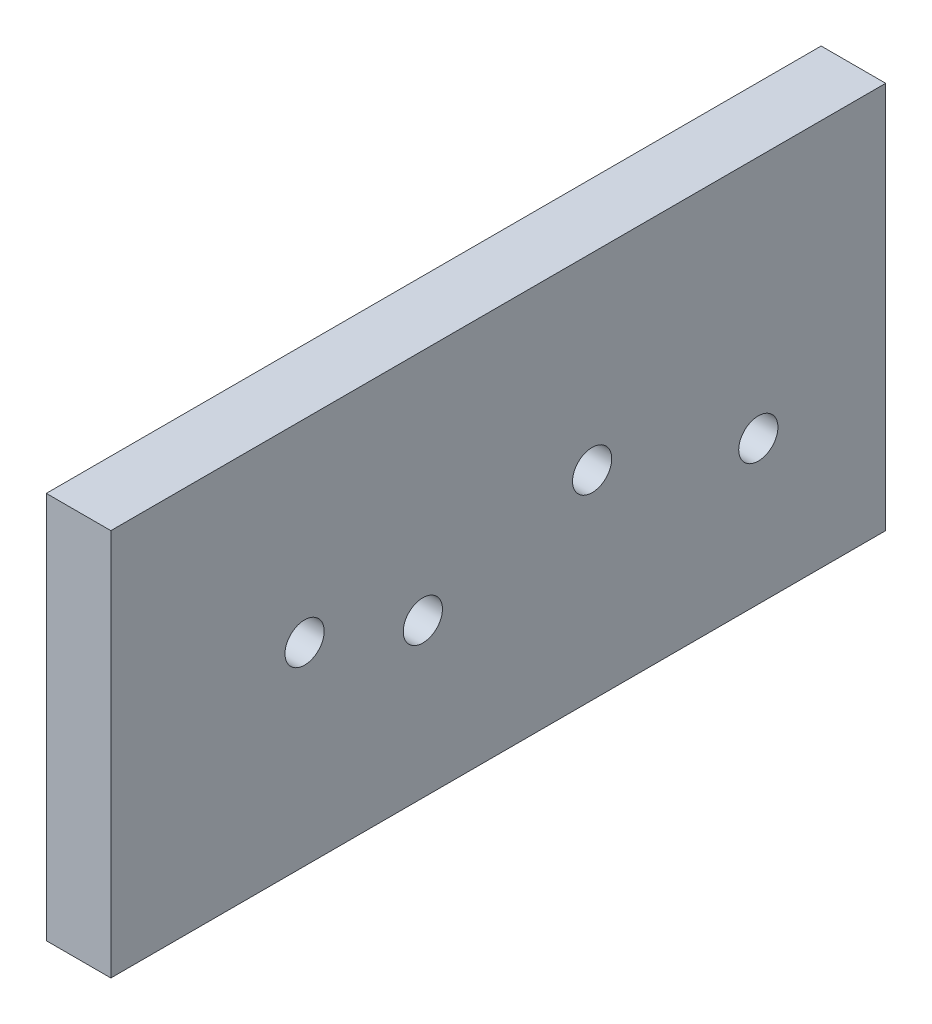
ISO-10303-21;
HEADER;
FILE_DESCRIPTION(('STEP AP214'),'2;1');
FILE_NAME('part.step','',(''),(''),'','','');
FILE_SCHEMA(('AUTOMOTIVE_DESIGN { 1 0 10303 214 1 1 1 1 }'));
ENDSEC;
DATA;
#1=APPLICATION_CONTEXT('core data for automotive mechanical design processes');
#2=APPLICATION_PROTOCOL_DEFINITION('international standard','automotive_design',2000,#1);
#3=PRODUCT_CONTEXT('',#1,'mechanical');
#4=PRODUCT('Part','Part','',(#3));
#5=PRODUCT_RELATED_PRODUCT_CATEGORY('part','',(#4));
#6=PRODUCT_DEFINITION_FORMATION('','',#4);
#7=PRODUCT_DEFINITION_CONTEXT('part definition',#1,'design');
#8=PRODUCT_DEFINITION('design','',#6,#7);
#9=PRODUCT_DEFINITION_SHAPE('','',#8);
#10=(LENGTH_UNIT() NAMED_UNIT(*) SI_UNIT(.MILLI.,.METRE.));
#11=(NAMED_UNIT(*) PLANE_ANGLE_UNIT() SI_UNIT($,.RADIAN.));
#12=(NAMED_UNIT(*) SI_UNIT($,.STERADIAN.) SOLID_ANGLE_UNIT());
#13=UNCERTAINTY_MEASURE_WITH_UNIT(LENGTH_MEASURE(1.E-05),#10,'distance_accuracy_value','');
#14=(GEOMETRIC_REPRESENTATION_CONTEXT(3) GLOBAL_UNCERTAINTY_ASSIGNED_CONTEXT((#13)) GLOBAL_UNIT_ASSIGNED_CONTEXT((#10,
#11,#12)) REPRESENTATION_CONTEXT('',''));
#15=CARTESIAN_POINT('',(0.,0.,0.));
#16=DIRECTION('',(0.,0.,1.));
#17=DIRECTION('',(1.,0.,0.));
#18=AXIS2_PLACEMENT_3D('',#15,#16,#17);
#19=CARTESIAN_POINT('',(12.7,-9.873506971,-51.1434579937716));
#20=DIRECTION('',(-1.,0.,0.));
#21=DIRECTION('',(0.,0.,1.));
#22=AXIS2_PLACEMENT_3D('',#19,#20,#21);
#23=CYLINDRICAL_SURFACE('',#22,3.85455777521835);
#24=CARTESIAN_POINT('',(12.7,-9.873506971,-51.1434579937716));
#25=DIRECTION('',(1.,0.,0.));
#26=DIRECTION('',(0.,0.,-1.));
#27=AXIS2_PLACEMENT_3D('',#24,#25,#26);
#28=CIRCLE('',#27,3.85455777521835);
#29=CARTESIAN_POINT('',(12.7,-9.873506971,-54.99801576899));
#30=VERTEX_POINT('',#29);
#31=EDGE_CURVE('E162',#30,#30,#28,.T.);
#32=ORIENTED_EDGE('',*,*,#31,.T.);
#33=EDGE_LOOP('',(#32));
#34=FACE_BOUND('',#33,.T.);
#35=CARTESIAN_POINT('',(6.35,-9.873506971,-51.1434579937716));
#36=DIRECTION('',(-1.,0.,0.));
#37=DIRECTION('',(0.,0.,1.));
#38=AXIS2_PLACEMENT_3D('',#35,#36,#37);
#39=CIRCLE('',#38,3.85455777521835);
#40=CARTESIAN_POINT('',(6.35,-9.873506971,-47.2889002185533));
#41=VERTEX_POINT('',#40);
#42=EDGE_CURVE('E53',#41,#41,#39,.T.);
#43=ORIENTED_EDGE('',*,*,#42,.T.);
#44=EDGE_LOOP('',(#43));
#45=FACE_BOUND('',#44,.T.);
#46=ADVANCED_FACE('F49',(#34,#45),#23,.F.);
#47=CARTESIAN_POINT('',(12.7,1.096077429,-18.4577335821185));
#48=DIRECTION('',(-1.,0.,0.));
#49=DIRECTION('',(0.,0.,1.));
#50=AXIS2_PLACEMENT_3D('',#47,#48,#49);
#51=CYLINDRICAL_SURFACE('',#50,3.85455777521835);
#52=CARTESIAN_POINT('',(12.7,1.096077429,-18.4577335821185));
#53=DIRECTION('',(1.,0.,0.));
#54=DIRECTION('',(0.,0.,-1.));
#55=AXIS2_PLACEMENT_3D('',#52,#53,#54);
#56=CIRCLE('',#55,3.85455777521835);
#57=CARTESIAN_POINT('',(12.7,1.096077429,-22.3122913573368));
#58=VERTEX_POINT('',#57);
#59=EDGE_CURVE('E158',#58,#58,#56,.T.);
#60=ORIENTED_EDGE('',*,*,#59,.T.);
#61=EDGE_LOOP('',(#60));
#62=FACE_BOUND('',#61,.T.);
#63=CARTESIAN_POINT('',(6.35,1.096077429,-18.4577335821185));
#64=DIRECTION('',(-1.,0.,0.));
#65=DIRECTION('',(0.,0.,1.));
#66=AXIS2_PLACEMENT_3D('',#63,#64,#65);
#67=CIRCLE('',#66,3.85455777521835);
#68=CARTESIAN_POINT('',(6.35,1.096077429,-14.6031758069001));
#69=VERTEX_POINT('',#68);
#70=EDGE_CURVE('E197',#69,#69,#67,.T.);
#71=ORIENTED_EDGE('',*,*,#70,.T.);
#72=EDGE_LOOP('',(#71));
#73=FACE_BOUND('',#72,.T.);
#74=ADVANCED_FACE('F285',(#62,#73),#51,.F.);
#75=CARTESIAN_POINT('',(12.7,0.,38.1));
#76=DIRECTION('',(-1.,0.,0.));
#77=DIRECTION('',(0.,0.,1.));
#78=AXIS2_PLACEMENT_3D('',#75,#76,#77);
#79=CYLINDRICAL_SURFACE('',#78,3.85455777521835);
#80=CARTESIAN_POINT('',(12.7,0.,38.1));
#81=DIRECTION('',(1.,0.,0.));
#82=DIRECTION('',(0.,0.,-1.));
#83=AXIS2_PLACEMENT_3D('',#80,#81,#82);
#84=CIRCLE('',#83,3.85455777521835);
#85=CARTESIAN_POINT('',(12.7,0.,34.2454422247817));
#86=VERTEX_POINT('',#85);
#87=EDGE_CURVE('E154',#86,#86,#84,.T.);
#88=ORIENTED_EDGE('',*,*,#87,.T.);
#89=EDGE_LOOP('',(#88));
#90=FACE_BOUND('',#89,.T.);
#91=CARTESIAN_POINT('',(6.35,0.,38.1));
#92=DIRECTION('',(-1.,0.,0.));
#93=DIRECTION('',(0.,0.,1.));
#94=AXIS2_PLACEMENT_3D('',#91,#92,#93);
#95=CIRCLE('',#94,3.85455777521835);
#96=CARTESIAN_POINT('',(6.35,0.,41.9545577752184));
#97=VERTEX_POINT('',#96);
#98=EDGE_CURVE('E193',#97,#97,#95,.T.);
#99=ORIENTED_EDGE('',*,*,#98,.T.);
#100=EDGE_LOOP('',(#99));
#101=FACE_BOUND('',#100,.T.);
#102=ADVANCED_FACE('F292',(#90,#101),#79,.F.);
#103=CARTESIAN_POINT('',(12.7,-7.860160654,14.8360220129459));
#104=DIRECTION('',(-1.,0.,0.));
#105=DIRECTION('',(0.,0.,1.));
#106=AXIS2_PLACEMENT_3D('',#103,#104,#105);
#107=CYLINDRICAL_SURFACE('',#106,3.85455777521835);
#108=CARTESIAN_POINT('',(12.7,-7.860160654,14.8360220129459));
#109=DIRECTION('',(1.,0.,0.));
#110=DIRECTION('',(0.,0.,-1.));
#111=AXIS2_PLACEMENT_3D('',#108,#109,#110);
#112=CIRCLE('',#111,3.85455777521835);
#113=CARTESIAN_POINT('',(12.7,-7.860160654,10.9814642377276));
#114=VERTEX_POINT('',#113);
#115=EDGE_CURVE('E166',#114,#114,#112,.T.);
#116=ORIENTED_EDGE('',*,*,#115,.T.);
#117=EDGE_LOOP('',(#116));
#118=FACE_BOUND('',#117,.T.);
#119=CARTESIAN_POINT('',(6.35,-7.860160654,14.8360220129459));
#120=DIRECTION('',(-1.,0.,0.));
#121=DIRECTION('',(0.,0.,1.));
#122=AXIS2_PLACEMENT_3D('',#119,#120,#121);
#123=CIRCLE('',#122,3.85455777521835);
#124=CARTESIAN_POINT('',(6.35,-7.860160654,18.6905797881643));
#125=VERTEX_POINT('',#124);
#126=EDGE_CURVE('E189',#125,#125,#123,.T.);
#127=ORIENTED_EDGE('',*,*,#126,.T.);
#128=EDGE_LOOP('',(#127));
#129=FACE_BOUND('',#128,.T.);
#130=ADVANCED_FACE('F296',(#118,#129),#107,.F.);
#131=CARTESIAN_POINT('',(12.7,-38.1,0.));
#132=DIRECTION('',(0.,1.,0.));
#133=DIRECTION('',(0.,0.,1.));
#134=AXIS2_PLACEMENT_3D('',#131,#132,#133);
#135=PLANE('',#134);
#136=CARTESIAN_POINT('',(6.35000000000002,-38.1,-63.5));
#137=DIRECTION('',(0.,-1.,0.));
#138=DIRECTION('',(0.,0.,-1.));
#139=AXIS2_PLACEMENT_3D('',#136,#137,#138);
#140=CIRCLE('',#139,3.17499999999999);
#141=CARTESIAN_POINT('',(6.35000000000002,-38.1,-66.675));
#142=VERTEX_POINT('',#141);
#143=EDGE_CURVE('E118',#142,#142,#140,.T.);
#144=ORIENTED_EDGE('',*,*,#143,.F.);
#145=EDGE_LOOP('',(#144));
#146=FACE_BOUND('',#145,.T.);
#147=CARTESIAN_POINT('',(6.35000000000001,-38.1,0.));
#148=DIRECTION('',(0.,-1.,0.));
#149=DIRECTION('',(0.,0.,-1.));
#150=AXIS2_PLACEMENT_3D('',#147,#148,#149);
#151=CIRCLE('',#150,3.17499999999999);
#152=CARTESIAN_POINT('',(6.35000000000001,-38.1,-3.17499999999997));
#153=VERTEX_POINT('',#152);
#154=EDGE_CURVE('E117',#153,#153,#151,.T.);
#155=ORIENTED_EDGE('',*,*,#154,.F.);
#156=EDGE_LOOP('',(#155));
#157=FACE_BOUND('',#156,.T.);
#158=CARTESIAN_POINT('',(6.35,-38.1,57.15));
#159=DIRECTION('',(0.,-1.,0.));
#160=DIRECTION('',(0.,0.,-1.));
#161=AXIS2_PLACEMENT_3D('',#158,#159,#160);
#162=CIRCLE('',#161,3.17499999999999);
#163=CARTESIAN_POINT('',(6.35,-38.1,53.975));
#164=VERTEX_POINT('',#163);
#165=EDGE_CURVE('E132',#164,#164,#162,.T.);
#166=ORIENTED_EDGE('',*,*,#165,.F.);
#167=EDGE_LOOP('',(#166));
#168=FACE_BOUND('',#167,.T.);
#169=DIRECTION('',(0.,0.,-1.));
#170=VECTOR('',#169,1.);
#171=CARTESIAN_POINT('',(0.,-38.1,0.));
#172=LINE('',#171,#170);
#173=CARTESIAN_POINT('',(0.,-38.1,76.2));
#174=VERTEX_POINT('',#173);
#175=CARTESIAN_POINT('',(0.,-38.1,-76.2));
#176=VERTEX_POINT('',#175);
#177=EDGE_CURVE('E140',#174,#176,#172,.T.);
#178=ORIENTED_EDGE('',*,*,#177,.T.);
#179=DIRECTION('',(-1.,0.,0.));
#180=VECTOR('',#179,1.);
#181=CARTESIAN_POINT('',(12.7,-38.1,-76.2));
#182=LINE('',#181,#180);
#183=CARTESIAN_POINT('',(12.7,-38.1,-76.2));
#184=VERTEX_POINT('',#183);
#185=EDGE_CURVE('E11',#184,#176,#182,.T.);
#186=ORIENTED_EDGE('',*,*,#185,.F.);
#187=DIRECTION('',(0.,0.,-1.));
#188=VECTOR('',#187,1.);
#189=CARTESIAN_POINT('',(12.7,-38.1,0.));
#190=LINE('',#189,#188);
#191=CARTESIAN_POINT('',(12.7,-38.1,76.2));
#192=VERTEX_POINT('',#191);
#193=EDGE_CURVE('E141',#192,#184,#190,.T.);
#194=ORIENTED_EDGE('',*,*,#193,.F.);
#195=DIRECTION('',(-1.,0.,0.));
#196=VECTOR('',#195,1.);
#197=CARTESIAN_POINT('',(12.7,-38.1,76.2));
#198=LINE('',#197,#196);
#199=EDGE_CURVE('E69',#192,#174,#198,.T.);
#200=ORIENTED_EDGE('',*,*,#199,.T.);
#201=EDGE_LOOP('',(#178,#186,#194,#200));
#202=FACE_BOUND('',#201,.T.);
#203=ADVANCED_FACE('F51',(#146,#157,#168,#202),#135,.F.);
#204=CARTESIAN_POINT('',(12.7,0.,-76.2));
#205=DIRECTION('',(0.,0.,1.));
#206=DIRECTION('',(1.,0.,0.));
#207=AXIS2_PLACEMENT_3D('',#204,#205,#206);
#208=PLANE('',#207);
#209=DIRECTION('',(0.,1.,0.));
#210=VECTOR('',#209,1.);
#211=CARTESIAN_POINT('',(0.,0.,-76.2));
#212=LINE('',#211,#210);
#213=CARTESIAN_POINT('',(0.,38.1,-76.2));
#214=VERTEX_POINT('',#213);
#215=EDGE_CURVE('E172',#176,#214,#212,.T.);
#216=ORIENTED_EDGE('',*,*,#215,.T.);
#217=DIRECTION('',(-1.,0.,0.));
#218=VECTOR('',#217,1.);
#219=CARTESIAN_POINT('',(12.7,38.1,-76.2));
#220=LINE('',#219,#218);
#221=CARTESIAN_POINT('',(12.7,38.1,-76.2));
#222=VERTEX_POINT('',#221);
#223=EDGE_CURVE('E60',#222,#214,#220,.T.);
#224=ORIENTED_EDGE('',*,*,#223,.F.);
#225=DIRECTION('',(0.,1.,0.));
#226=VECTOR('',#225,1.);
#227=CARTESIAN_POINT('',(12.7,0.,-76.2));
#228=LINE('',#227,#226);
#229=EDGE_CURVE('E95',#184,#222,#228,.T.);
#230=ORIENTED_EDGE('',*,*,#229,.F.);
#231=ORIENTED_EDGE('',*,*,#185,.T.);
#232=EDGE_LOOP('',(#216,#224,#230,#231));
#233=FACE_BOUND('',#232,.T.);
#234=ADVANCED_FACE('F280',(#233),#208,.F.);
#235=CARTESIAN_POINT('',(12.7,38.1,0.));
#236=DIRECTION('',(0.,1.,0.));
#237=DIRECTION('',(0.,0.,1.));
#238=AXIS2_PLACEMENT_3D('',#235,#236,#237);
#239=PLANE('',#238);
#240=DIRECTION('',(0.,0.,-1.));
#241=VECTOR('',#240,1.);
#242=CARTESIAN_POINT('',(0.,38.1,0.));
#243=LINE('',#242,#241);
#244=CARTESIAN_POINT('',(0.,38.1,76.2));
#245=VERTEX_POINT('',#244);
#246=EDGE_CURVE('E176',#245,#214,#243,.T.);
#247=ORIENTED_EDGE('',*,*,#246,.F.);
#248=DIRECTION('',(-1.,0.,0.));
#249=VECTOR('',#248,1.);
#250=CARTESIAN_POINT('',(12.7,38.1,76.2));
#251=LINE('',#250,#249);
#252=CARTESIAN_POINT('',(12.7,38.1,76.2));
#253=VERTEX_POINT('',#252);
#254=EDGE_CURVE('E84',#253,#245,#251,.T.);
#255=ORIENTED_EDGE('',*,*,#254,.F.);
#256=DIRECTION('',(0.,0.,-1.));
#257=VECTOR('',#256,1.);
#258=CARTESIAN_POINT('',(12.7,38.1,0.));
#259=LINE('',#258,#257);
#260=EDGE_CURVE('E147',#253,#222,#259,.T.);
#261=ORIENTED_EDGE('',*,*,#260,.T.);
#262=ORIENTED_EDGE('',*,*,#223,.T.);
#263=EDGE_LOOP('',(#247,#255,#261,#262));
#264=FACE_BOUND('',#263,.T.);
#265=ADVANCED_FACE('F271',(#264),#239,.T.);
#266=CARTESIAN_POINT('',(12.7,0.,76.2));
#267=DIRECTION('',(0.,0.,1.));
#268=DIRECTION('',(1.,0.,0.));
#269=AXIS2_PLACEMENT_3D('',#266,#267,#268);
#270=PLANE('',#269);
#271=DIRECTION('',(0.,1.,0.));
#272=VECTOR('',#271,1.);
#273=CARTESIAN_POINT('',(0.,0.,76.2));
#274=LINE('',#273,#272);
#275=EDGE_CURVE('E144',#174,#245,#274,.T.);
#276=ORIENTED_EDGE('',*,*,#275,.F.);
#277=ORIENTED_EDGE('',*,*,#199,.F.);
#278=DIRECTION('',(0.,1.,0.));
#279=VECTOR('',#278,1.);
#280=CARTESIAN_POINT('',(12.7,0.,76.2));
#281=LINE('',#280,#279);
#282=EDGE_CURVE('E151',#192,#253,#281,.T.);
#283=ORIENTED_EDGE('',*,*,#282,.T.);
#284=ORIENTED_EDGE('',*,*,#254,.T.);
#285=EDGE_LOOP('',(#276,#277,#283,#284));
#286=FACE_BOUND('',#285,.T.);
#287=ADVANCED_FACE('F269',(#286),#270,.T.);
#288=CARTESIAN_POINT('',(12.7,0.,0.));
#289=DIRECTION('',(1.,0.,0.));
#290=DIRECTION('',(0.,0.,-1.));
#291=AXIS2_PLACEMENT_3D('',#288,#289,#290);
#292=PLANE('',#291);
#293=ORIENTED_EDGE('',*,*,#193,.T.);
#294=ORIENTED_EDGE('',*,*,#229,.T.);
#295=ORIENTED_EDGE('',*,*,#260,.F.);
#296=ORIENTED_EDGE('',*,*,#282,.F.);
#297=EDGE_LOOP('',(#293,#294,#295,#296));
#298=FACE_BOUND('',#297,.T.);
#299=ORIENTED_EDGE('',*,*,#87,.F.);
#300=EDGE_LOOP('',(#299));
#301=FACE_BOUND('',#300,.T.);
#302=ORIENTED_EDGE('',*,*,#59,.F.);
#303=EDGE_LOOP('',(#302));
#304=FACE_BOUND('',#303,.T.);
#305=ORIENTED_EDGE('',*,*,#31,.F.);
#306=EDGE_LOOP('',(#305));
#307=FACE_BOUND('',#306,.T.);
#308=ORIENTED_EDGE('',*,*,#115,.F.);
#309=EDGE_LOOP('',(#308));
#310=FACE_BOUND('',#309,.T.);
#311=ADVANCED_FACE('F260',(#298,#301,#304,#307,#310),#292,.T.);
#312=CARTESIAN_POINT('',(0.,0.,0.));
#313=DIRECTION('',(1.,0.,0.));
#314=DIRECTION('',(0.,0.,-1.));
#315=AXIS2_PLACEMENT_3D('',#312,#313,#314);
#316=PLANE('',#315);
#317=CARTESIAN_POINT('',(0.,0.,38.1));
#318=DIRECTION('',(-1.,0.,0.));
#319=DIRECTION('',(0.,0.,1.));
#320=AXIS2_PLACEMENT_3D('',#317,#318,#319);
#321=CIRCLE('',#320,7.9375);
#322=CARTESIAN_POINT('',(0.,0.,46.0375));
#323=VERTEX_POINT('',#322);
#324=EDGE_CURVE('E239',#323,#323,#321,.T.);
#325=ORIENTED_EDGE('',*,*,#324,.F.);
#326=EDGE_LOOP('',(#325));
#327=FACE_BOUND('',#326,.T.);
#328=CARTESIAN_POINT('',(0.,-7.860160654,14.8360220129459));
#329=DIRECTION('',(-1.,0.,0.));
#330=DIRECTION('',(0.,0.,1.));
#331=AXIS2_PLACEMENT_3D('',#328,#329,#330);
#332=CIRCLE('',#331,7.9375);
#333=CARTESIAN_POINT('',(0.,-7.860160654,22.7735220129459));
#334=VERTEX_POINT('',#333);
#335=EDGE_CURVE('E235',#334,#334,#332,.T.);
#336=ORIENTED_EDGE('',*,*,#335,.F.);
#337=EDGE_LOOP('',(#336));
#338=FACE_BOUND('',#337,.T.);
#339=CARTESIAN_POINT('',(0.,1.096077429,-18.4577335821185));
#340=DIRECTION('',(-1.,0.,0.));
#341=DIRECTION('',(0.,0.,1.));
#342=AXIS2_PLACEMENT_3D('',#339,#340,#341);
#343=CIRCLE('',#342,7.9375);
#344=CARTESIAN_POINT('',(0.,1.096077429,-10.5202335821185));
#345=VERTEX_POINT('',#344);
#346=EDGE_CURVE('E227',#345,#345,#343,.T.);
#347=ORIENTED_EDGE('',*,*,#346,.F.);
#348=EDGE_LOOP('',(#347));
#349=FACE_BOUND('',#348,.T.);
#350=CARTESIAN_POINT('',(0.,-9.873506971,-51.1434579937716));
#351=DIRECTION('',(-1.,0.,0.));
#352=DIRECTION('',(0.,0.,1.));
#353=AXIS2_PLACEMENT_3D('',#350,#351,#352);
#354=CIRCLE('',#353,7.9375);
#355=CARTESIAN_POINT('',(0.,-9.873506971,-43.2059579937716));
#356=VERTEX_POINT('',#355);
#357=EDGE_CURVE('E218',#356,#356,#354,.T.);
#358=ORIENTED_EDGE('',*,*,#357,.F.);
#359=EDGE_LOOP('',(#358));
#360=FACE_BOUND('',#359,.T.);
#361=ORIENTED_EDGE('',*,*,#177,.F.);
#362=ORIENTED_EDGE('',*,*,#275,.T.);
#363=ORIENTED_EDGE('',*,*,#246,.T.);
#364=ORIENTED_EDGE('',*,*,#215,.F.);
#365=EDGE_LOOP('',(#361,#362,#363,#364));
#366=FACE_BOUND('',#365,.T.);
#367=ADVANCED_FACE('F256',(#327,#338,#349,#360,#366),#316,.F.);
#368=CARTESIAN_POINT('',(6.35,-25.4,57.15));
#369=DIRECTION('',(0.,-1.,0.));
#370=DIRECTION('',(0.,0.,-1.));
#371=AXIS2_PLACEMENT_3D('',#368,#369,#370);
#372=CONICAL_SURFACE('',#371,3.17499999999999,1.02974425867665);
#373=CARTESIAN_POINT('',(6.35,-23.4922675345875,57.15));
#374=VERTEX_POINT('',#373);
#375=VERTEX_LOOP('',#374);
#376=FACE_BOUND('',#375,.T.);
#377=CARTESIAN_POINT('',(6.35,-25.4,57.15));
#378=DIRECTION('',(0.,-1.,0.));
#379=DIRECTION('',(0.,0.,-1.));
#380=AXIS2_PLACEMENT_3D('',#377,#378,#379);
#381=CIRCLE('',#380,3.17499999999999);
#382=CARTESIAN_POINT('',(6.35,-25.4,53.975));
#383=VERTEX_POINT('',#382);
#384=EDGE_CURVE('E136',#383,#383,#381,.T.);
#385=ORIENTED_EDGE('',*,*,#384,.T.);
#386=EDGE_LOOP('',(#385));
#387=FACE_BOUND('',#386,.T.);
#388=ADVANCED_FACE('F259',(#376,#387),#372,.F.);
#389=CARTESIAN_POINT('',(6.35,-38.1,57.15));
#390=DIRECTION('',(0.,-1.,0.));
#391=DIRECTION('',(0.,0.,-1.));
#392=AXIS2_PLACEMENT_3D('',#389,#390,#391);
#393=CYLINDRICAL_SURFACE('',#392,3.17499999999999);
#394=ORIENTED_EDGE('',*,*,#384,.F.);
#395=EDGE_LOOP('',(#394));
#396=FACE_BOUND('',#395,.T.);
#397=ORIENTED_EDGE('',*,*,#165,.T.);
#398=EDGE_LOOP('',(#397));
#399=FACE_BOUND('',#398,.T.);
#400=ADVANCED_FACE('F335',(#396,#399),#393,.F.);
#401=CARTESIAN_POINT('',(6.35000000000001,-25.4,0.));
#402=DIRECTION('',(0.,-1.,0.));
#403=DIRECTION('',(0.,0.,-1.));
#404=AXIS2_PLACEMENT_3D('',#401,#402,#403);
#405=CONICAL_SURFACE('',#404,3.17499999999999,1.02974425867665);
#406=CARTESIAN_POINT('',(6.35,-23.4922675345875,0.));
#407=VERTEX_POINT('',#406);
#408=VERTEX_LOOP('',#407);
#409=FACE_BOUND('',#408,.T.);
#410=CARTESIAN_POINT('',(6.35000000000001,-25.4,0.));
#411=DIRECTION('',(0.,-1.,0.));
#412=DIRECTION('',(0.,0.,-1.));
#413=AXIS2_PLACEMENT_3D('',#410,#411,#412);
#414=CIRCLE('',#413,3.17499999999999);
#415=CARTESIAN_POINT('',(6.35000000000001,-25.4,-3.17499999999997));
#416=VERTEX_POINT('',#415);
#417=EDGE_CURVE('E123',#416,#416,#414,.T.);
#418=ORIENTED_EDGE('',*,*,#417,.T.);
#419=EDGE_LOOP('',(#418));
#420=FACE_BOUND('',#419,.T.);
#421=ADVANCED_FACE('F331',(#409,#420),#405,.F.);
#422=CARTESIAN_POINT('',(6.35000000000001,-38.1,0.));
#423=DIRECTION('',(0.,-1.,0.));
#424=DIRECTION('',(0.,0.,-1.));
#425=AXIS2_PLACEMENT_3D('',#422,#423,#424);
#426=CYLINDRICAL_SURFACE('',#425,3.17499999999999);
#427=ORIENTED_EDGE('',*,*,#417,.F.);
#428=EDGE_LOOP('',(#427));
#429=FACE_BOUND('',#428,.T.);
#430=ORIENTED_EDGE('',*,*,#154,.T.);
#431=EDGE_LOOP('',(#430));
#432=FACE_BOUND('',#431,.T.);
#433=ADVANCED_FACE('F110',(#429,#432),#426,.F.);
#434=CARTESIAN_POINT('',(6.35000000000002,-25.4,-63.5));
#435=DIRECTION('',(0.,-1.,0.));
#436=DIRECTION('',(0.,0.,-1.));
#437=AXIS2_PLACEMENT_3D('',#434,#435,#436);
#438=CONICAL_SURFACE('',#437,3.17499999999999,1.02974425867665);
#439=CARTESIAN_POINT('',(6.35000000000001,-23.4922675345875,-63.5));
#440=VERTEX_POINT('',#439);
#441=VERTEX_LOOP('',#440);
#442=FACE_BOUND('',#441,.T.);
#443=CARTESIAN_POINT('',(6.35000000000002,-25.4,-63.5));
#444=DIRECTION('',(0.,-1.,0.));
#445=DIRECTION('',(0.,0.,-1.));
#446=AXIS2_PLACEMENT_3D('',#443,#444,#445);
#447=CIRCLE('',#446,3.17499999999999);
#448=CARTESIAN_POINT('',(6.35000000000002,-25.4,-66.675));
#449=VERTEX_POINT('',#448);
#450=EDGE_CURVE('E114',#449,#449,#447,.T.);
#451=ORIENTED_EDGE('',*,*,#450,.T.);
#452=EDGE_LOOP('',(#451));
#453=FACE_BOUND('',#452,.T.);
#454=ADVANCED_FACE('F106',(#442,#453),#438,.F.);
#455=CARTESIAN_POINT('',(6.35000000000002,-38.1,-63.5));
#456=DIRECTION('',(0.,-1.,0.));
#457=DIRECTION('',(0.,0.,-1.));
#458=AXIS2_PLACEMENT_3D('',#455,#456,#457);
#459=CYLINDRICAL_SURFACE('',#458,3.17499999999999);
#460=ORIENTED_EDGE('',*,*,#450,.F.);
#461=EDGE_LOOP('',(#460));
#462=FACE_BOUND('',#461,.T.);
#463=ORIENTED_EDGE('',*,*,#143,.T.);
#464=EDGE_LOOP('',(#463));
#465=FACE_BOUND('',#464,.T.);
#466=ADVANCED_FACE('F109',(#462,#465),#459,.F.);
#467=CARTESIAN_POINT('',(6.35,-9.873506971,-51.1434579937716));
#468=DIRECTION('',(-1.,0.,0.));
#469=DIRECTION('',(0.,0.,1.));
#470=AXIS2_PLACEMENT_3D('',#467,#468,#469);
#471=CYLINDRICAL_SURFACE('',#470,7.9375);
#472=CARTESIAN_POINT('',(6.35,-9.873506971,-51.1434579937716));
#473=DIRECTION('',(-1.,0.,0.));
#474=DIRECTION('',(0.,0.,1.));
#475=AXIS2_PLACEMENT_3D('',#472,#473,#474);
#476=CIRCLE('',#475,7.9375);
#477=CARTESIAN_POINT('',(6.35,-9.873506971,-43.2059579937716));
#478=VERTEX_POINT('',#477);
#479=EDGE_CURVE('E215',#478,#478,#476,.T.);
#480=ORIENTED_EDGE('',*,*,#479,.F.);
#481=EDGE_LOOP('',(#480));
#482=FACE_BOUND('',#481,.T.);
#483=ORIENTED_EDGE('',*,*,#357,.T.);
#484=EDGE_LOOP('',(#483));
#485=FACE_BOUND('',#484,.T.);
#486=ADVANCED_FACE('F211',(#482,#485),#471,.F.);
#487=CARTESIAN_POINT('',(6.35,-9.873506971,-51.1434579937716));
#488=DIRECTION('',(-1.,0.,0.));
#489=DIRECTION('',(0.,0.,1.));
#490=AXIS2_PLACEMENT_3D('',#487,#488,#489);
#491=PLANE('',#490);
#492=ORIENTED_EDGE('',*,*,#42,.F.);
#493=EDGE_LOOP('',(#492));
#494=FACE_BOUND('',#493,.T.);
#495=ORIENTED_EDGE('',*,*,#479,.T.);
#496=EDGE_LOOP('',(#495));
#497=FACE_BOUND('',#496,.T.);
#498=ADVANCED_FACE('F207',(#494,#497),#491,.T.);
#499=CARTESIAN_POINT('',(6.35,1.096077429,-18.4577335821185));
#500=DIRECTION('',(-1.,0.,0.));
#501=DIRECTION('',(0.,0.,1.));
#502=AXIS2_PLACEMENT_3D('',#499,#500,#501);
#503=CYLINDRICAL_SURFACE('',#502,7.9375);
#504=CARTESIAN_POINT('',(6.35,1.096077429,-18.4577335821185));
#505=DIRECTION('',(-1.,0.,0.));
#506=DIRECTION('',(0.,0.,1.));
#507=AXIS2_PLACEMENT_3D('',#504,#505,#506);
#508=CIRCLE('',#507,7.9375);
#509=CARTESIAN_POINT('',(6.35,1.096077429,-10.5202335821185));
#510=VERTEX_POINT('',#509);
#511=EDGE_CURVE('E221',#510,#510,#508,.T.);
#512=ORIENTED_EDGE('',*,*,#511,.F.);
#513=EDGE_LOOP('',(#512));
#514=FACE_BOUND('',#513,.T.);
#515=ORIENTED_EDGE('',*,*,#346,.T.);
#516=EDGE_LOOP('',(#515));
#517=FACE_BOUND('',#516,.T.);
#518=ADVANCED_FACE('F210',(#514,#517),#503,.F.);
#519=CARTESIAN_POINT('',(6.35,1.096077429,-18.4577335821185));
#520=DIRECTION('',(-1.,0.,0.));
#521=DIRECTION('',(0.,0.,1.));
#522=AXIS2_PLACEMENT_3D('',#519,#520,#521);
#523=PLANE('',#522);
#524=ORIENTED_EDGE('',*,*,#70,.F.);
#525=EDGE_LOOP('',(#524));
#526=FACE_BOUND('',#525,.T.);
#527=ORIENTED_EDGE('',*,*,#511,.T.);
#528=EDGE_LOOP('',(#527));
#529=FACE_BOUND('',#528,.T.);
#530=ADVANCED_FACE('F315',(#526,#529),#523,.T.);
#531=CARTESIAN_POINT('',(6.35,-7.860160654,14.8360220129459));
#532=DIRECTION('',(-1.,0.,0.));
#533=DIRECTION('',(0.,0.,1.));
#534=AXIS2_PLACEMENT_3D('',#531,#532,#533);
#535=CYLINDRICAL_SURFACE('',#534,7.9375);
#536=CARTESIAN_POINT('',(6.35,-7.860160654,14.8360220129459));
#537=DIRECTION('',(-1.,0.,0.));
#538=DIRECTION('',(0.,0.,1.));
#539=AXIS2_PLACEMENT_3D('',#536,#537,#538);
#540=CIRCLE('',#539,7.9375);
#541=CARTESIAN_POINT('',(6.35,-7.860160654,22.7735220129459));
#542=VERTEX_POINT('',#541);
#543=EDGE_CURVE('E231',#542,#542,#540,.T.);
#544=ORIENTED_EDGE('',*,*,#543,.F.);
#545=EDGE_LOOP('',(#544));
#546=FACE_BOUND('',#545,.T.);
#547=ORIENTED_EDGE('',*,*,#335,.T.);
#548=EDGE_LOOP('',(#547));
#549=FACE_BOUND('',#548,.T.);
#550=ADVANCED_FACE('F312',(#546,#549),#535,.F.);
#551=CARTESIAN_POINT('',(6.35,-7.860160654,14.8360220129459));
#552=DIRECTION('',(-1.,0.,0.));
#553=DIRECTION('',(0.,0.,1.));
#554=AXIS2_PLACEMENT_3D('',#551,#552,#553);
#555=PLANE('',#554);
#556=ORIENTED_EDGE('',*,*,#126,.F.);
#557=EDGE_LOOP('',(#556));
#558=FACE_BOUND('',#557,.T.);
#559=ORIENTED_EDGE('',*,*,#543,.T.);
#560=EDGE_LOOP('',(#559));
#561=FACE_BOUND('',#560,.T.);
#562=ADVANCED_FACE('F252',(#558,#561),#555,.T.);
#563=CARTESIAN_POINT('',(6.35,0.,38.1));
#564=DIRECTION('',(-1.,0.,0.));
#565=DIRECTION('',(0.,0.,1.));
#566=AXIS2_PLACEMENT_3D('',#563,#564,#565);
#567=CYLINDRICAL_SURFACE('',#566,7.9375);
#568=CARTESIAN_POINT('',(6.35,0.,38.1));
#569=DIRECTION('',(-1.,0.,0.));
#570=DIRECTION('',(0.,0.,1.));
#571=AXIS2_PLACEMENT_3D('',#568,#569,#570);
#572=CIRCLE('',#571,7.9375);
#573=CARTESIAN_POINT('',(6.35,0.,46.0375));
#574=VERTEX_POINT('',#573);
#575=EDGE_CURVE('E194',#574,#574,#572,.T.);
#576=ORIENTED_EDGE('',*,*,#575,.F.);
#577=EDGE_LOOP('',(#576));
#578=FACE_BOUND('',#577,.T.);
#579=ORIENTED_EDGE('',*,*,#324,.T.);
#580=EDGE_LOOP('',(#579));
#581=FACE_BOUND('',#580,.T.);
#582=ADVANCED_FACE('F249',(#578,#581),#567,.F.);
#583=CARTESIAN_POINT('',(6.35,0.,38.1));
#584=DIRECTION('',(-1.,0.,0.));
#585=DIRECTION('',(0.,0.,1.));
#586=AXIS2_PLACEMENT_3D('',#583,#584,#585);
#587=PLANE('',#586);
#588=ORIENTED_EDGE('',*,*,#98,.F.);
#589=EDGE_LOOP('',(#588));
#590=FACE_BOUND('',#589,.T.);
#591=ORIENTED_EDGE('',*,*,#575,.T.);
#592=EDGE_LOOP('',(#591));
#593=FACE_BOUND('',#592,.T.);
#594=ADVANCED_FACE('F247',(#590,#593),#587,.T.);
#595=CLOSED_SHELL('',(#46,#74,#102,#130,#203,#234,#265,#287,#311,#367,#388,#400,#421,#433,#454,
#466,#486,#498,#518,#530,#550,#562,#582,#594));
#596=MANIFOLD_SOLID_BREP('B2',#595);
#597=ADVANCED_BREP_SHAPE_REPRESENTATION('',(#18,#596),#14);
#598=SHAPE_DEFINITION_REPRESENTATION(#9,#597);
ENDSEC;
END-ISO-10303-21;
